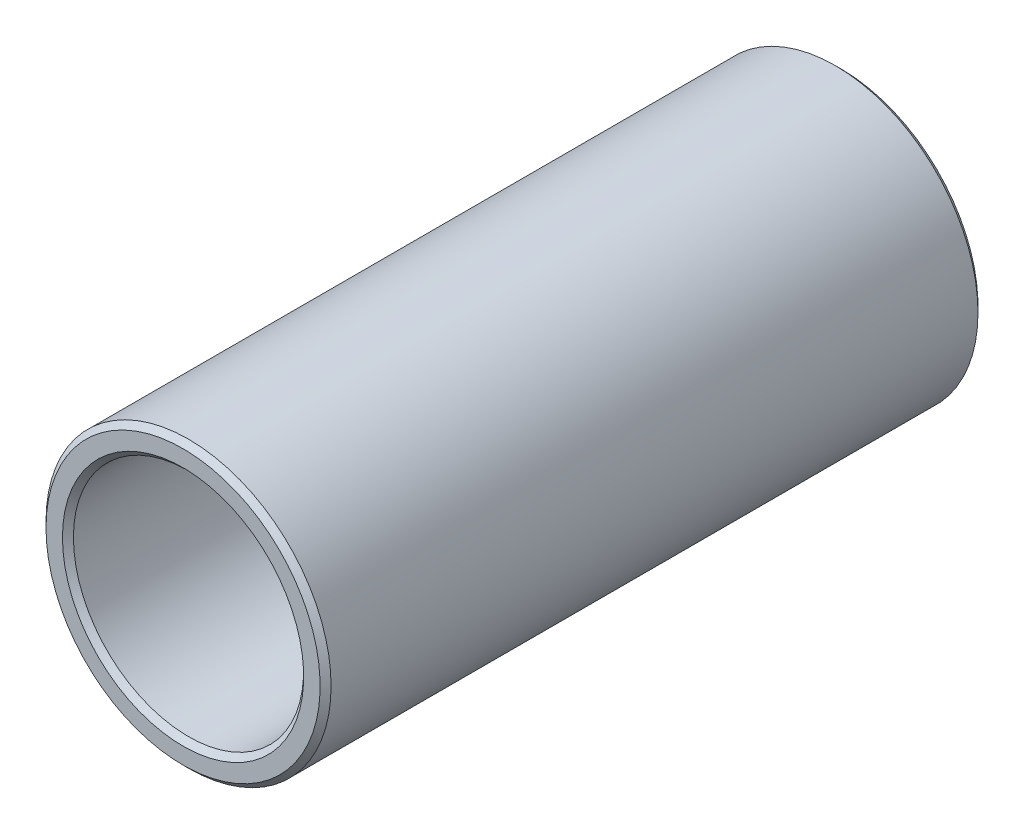
ISO-10303-21;
HEADER;
FILE_DESCRIPTION(('STEP AP214'),'2;1');
FILE_NAME('part.step','',(''),(''),'','','');
FILE_SCHEMA(('AUTOMOTIVE_DESIGN { 1 0 10303 214 1 1 1 1 }'));
ENDSEC;
DATA;
#1=APPLICATION_CONTEXT('core data for automotive mechanical design processes');
#2=APPLICATION_PROTOCOL_DEFINITION('international standard','automotive_design',2000,#1);
#3=PRODUCT_CONTEXT('',#1,'mechanical');
#4=PRODUCT('Part','Part','',(#3));
#5=PRODUCT_RELATED_PRODUCT_CATEGORY('part','',(#4));
#6=PRODUCT_DEFINITION_FORMATION('','',#4);
#7=PRODUCT_DEFINITION_CONTEXT('part definition',#1,'design');
#8=PRODUCT_DEFINITION('design','',#6,#7);
#9=PRODUCT_DEFINITION_SHAPE('','',#8);
#10=(LENGTH_UNIT() NAMED_UNIT(*) SI_UNIT(.MILLI.,.METRE.));
#11=(NAMED_UNIT(*) PLANE_ANGLE_UNIT() SI_UNIT($,.RADIAN.));
#12=(NAMED_UNIT(*) SI_UNIT($,.STERADIAN.) SOLID_ANGLE_UNIT());
#13=UNCERTAINTY_MEASURE_WITH_UNIT(LENGTH_MEASURE(1.E-05),#10,'distance_accuracy_value','');
#14=(GEOMETRIC_REPRESENTATION_CONTEXT(3) GLOBAL_UNCERTAINTY_ASSIGNED_CONTEXT((#13)) GLOBAL_UNIT_ASSIGNED_CONTEXT((#10,
#11,#12)) REPRESENTATION_CONTEXT('',''));
#15=CARTESIAN_POINT('',(0.,0.,0.));
#16=DIRECTION('',(0.,0.,1.));
#17=DIRECTION('',(1.,0.,0.));
#18=AXIS2_PLACEMENT_3D('',#15,#16,#17);
#19=CARTESIAN_POINT('',(0.,0.,60.005));
#20=DIRECTION('',(0.,0.,-1.));
#21=DIRECTION('',(-1.,0.,0.));
#22=AXIS2_PLACEMENT_3D('',#19,#20,#21);
#23=CYLINDRICAL_SURFACE('',#22,5.053);
#24=CARTESIAN_POINT('',(0.,0.,0.947000000000003));
#25=DIRECTION('',(0.,0.,-1.));
#26=DIRECTION('',(-1.,0.,0.));
#27=AXIS2_PLACEMENT_3D('',#24,#25,#26);
#28=CIRCLE('',#27,5.053);
#29=CARTESIAN_POINT('',(-5.053,0.,0.947000000000003));
#30=VERTEX_POINT('',#29);
#31=EDGE_CURVE('E10',#30,#30,#28,.T.);
#32=ORIENTED_EDGE('',*,*,#31,.T.);
#33=EDGE_LOOP('',(#32));
#34=FACE_BOUND('',#33,.T.);
#35=CARTESIAN_POINT('',(0.,0.,12.053));
#36=DIRECTION('',(0.,0.,-1.));
#37=DIRECTION('',(-1.,0.,0.));
#38=AXIS2_PLACEMENT_3D('',#35,#36,#37);
#39=CIRCLE('',#38,5.053);
#40=CARTESIAN_POINT('',(-5.053,0.,12.053));
#41=VERTEX_POINT('',#40);
#42=EDGE_CURVE('E69',#41,#41,#39,.T.);
#43=ORIENTED_EDGE('',*,*,#42,.F.);
#44=EDGE_LOOP('',(#43));
#45=FACE_BOUND('',#44,.T.);
#46=ADVANCED_FACE('F35',(#34,#45),#23,.F.);
#47=CARTESIAN_POINT('',(0.,0.,0.947000000000003));
#48=DIRECTION('',(0.,0.,-1.));
#49=DIRECTION('',(-1.,0.,0.));
#50=AXIS2_PLACEMENT_3D('',#47,#48,#49);
#51=CONICAL_SURFACE('',#50,5.053,0.785398163397447);
#52=CARTESIAN_POINT('',(0.,0.,0.));
#53=DIRECTION('',(0.,0.,-1.));
#54=DIRECTION('',(-1.,0.,0.));
#55=AXIS2_PLACEMENT_3D('',#52,#53,#54);
#56=CIRCLE('',#55,6.);
#57=CARTESIAN_POINT('',(-6.,0.,0.));
#58=VERTEX_POINT('',#57);
#59=EDGE_CURVE('E41',#58,#58,#56,.T.);
#60=ORIENTED_EDGE('',*,*,#59,.T.);
#61=EDGE_LOOP('',(#60));
#62=FACE_BOUND('',#61,.T.);
#63=ORIENTED_EDGE('',*,*,#31,.F.);
#64=EDGE_LOOP('',(#63));
#65=FACE_BOUND('',#64,.T.);
#66=ADVANCED_FACE('F77',(#62,#65),#51,.F.);
#67=CARTESIAN_POINT('',(6.,0.,0.));
#68=DIRECTION('',(0.,0.,-1.));
#69=DIRECTION('',(-1.,0.,0.));
#70=AXIS2_PLACEMENT_3D('',#67,#68,#69);
#71=PLANE('',#70);
#72=CARTESIAN_POINT('',(0.,0.,0.));
#73=DIRECTION('',(0.,0.,-1.));
#74=DIRECTION('',(-1.,0.,0.));
#75=AXIS2_PLACEMENT_3D('',#72,#73,#74);
#76=CIRCLE('',#75,12.5);
#77=CARTESIAN_POINT('',(-12.5,0.,0.));
#78=VERTEX_POINT('',#77);
#79=EDGE_CURVE('E45',#78,#78,#76,.T.);
#80=ORIENTED_EDGE('',*,*,#79,.T.);
#81=EDGE_LOOP('',(#80));
#82=FACE_BOUND('',#81,.T.);
#83=ORIENTED_EDGE('',*,*,#59,.F.);
#84=EDGE_LOOP('',(#83));
#85=FACE_BOUND('',#84,.T.);
#86=ADVANCED_FACE('F81',(#82,#85),#71,.T.);
#87=CARTESIAN_POINT('',(0.,0.,0.));
#88=DIRECTION('',(0.,0.,1.));
#89=DIRECTION('',(1.,0.,0.));
#90=AXIS2_PLACEMENT_3D('',#87,#88,#89);
#91=CONICAL_SURFACE('',#90,12.5,0.78539816339745);
#92=CARTESIAN_POINT('',(0.,0.,0.5));
#93=DIRECTION('',(0.,0.,-1.));
#94=DIRECTION('',(-1.,0.,0.));
#95=AXIS2_PLACEMENT_3D('',#92,#93,#94);
#96=CIRCLE('',#95,13.);
#97=CARTESIAN_POINT('',(-13.,0.,0.5));
#98=VERTEX_POINT('',#97);
#99=EDGE_CURVE('E49',#98,#98,#96,.T.);
#100=ORIENTED_EDGE('',*,*,#99,.T.);
#101=EDGE_LOOP('',(#100));
#102=FACE_BOUND('',#101,.T.);
#103=ORIENTED_EDGE('',*,*,#79,.F.);
#104=EDGE_LOOP('',(#103));
#105=FACE_BOUND('',#104,.T.);
#106=ADVANCED_FACE('F85',(#102,#105),#91,.T.);
#107=CARTESIAN_POINT('',(0.,0.,60.005));
#108=DIRECTION('',(0.,0.,-1.));
#109=DIRECTION('',(-1.,0.,0.));
#110=AXIS2_PLACEMENT_3D('',#107,#108,#109);
#111=CYLINDRICAL_SURFACE('',#110,13.);
#112=CARTESIAN_POINT('',(0.,0.,59.5));
#113=DIRECTION('',(0.,0.,-1.));
#114=DIRECTION('',(-1.,0.,0.));
#115=AXIS2_PLACEMENT_3D('',#112,#113,#114);
#116=CIRCLE('',#115,13.);
#117=CARTESIAN_POINT('',(-13.,0.,59.5));
#118=VERTEX_POINT('',#117);
#119=EDGE_CURVE('E54',#118,#118,#116,.T.);
#120=ORIENTED_EDGE('',*,*,#119,.T.);
#121=EDGE_LOOP('',(#120));
#122=FACE_BOUND('',#121,.T.);
#123=ORIENTED_EDGE('',*,*,#99,.F.);
#124=EDGE_LOOP('',(#123));
#125=FACE_BOUND('',#124,.T.);
#126=ADVANCED_FACE('F92',(#122,#125),#111,.T.);
#127=CARTESIAN_POINT('',(0.,0.,59.5));
#128=DIRECTION('',(0.,0.,-1.));
#129=DIRECTION('',(-1.,0.,0.));
#130=AXIS2_PLACEMENT_3D('',#127,#128,#129);
#131=CONICAL_SURFACE('',#130,13.,0.78539816339745);
#132=CARTESIAN_POINT('',(0.,0.,60.));
#133=DIRECTION('',(0.,0.,-1.));
#134=DIRECTION('',(-1.,0.,0.));
#135=AXIS2_PLACEMENT_3D('',#132,#133,#134);
#136=CIRCLE('',#135,12.5);
#137=CARTESIAN_POINT('',(-12.5,0.,60.));
#138=VERTEX_POINT('',#137);
#139=EDGE_CURVE('E57',#138,#138,#136,.T.);
#140=ORIENTED_EDGE('',*,*,#139,.T.);
#141=EDGE_LOOP('',(#140));
#142=FACE_BOUND('',#141,.T.);
#143=ORIENTED_EDGE('',*,*,#119,.F.);
#144=EDGE_LOOP('',(#143));
#145=FACE_BOUND('',#144,.T.);
#146=ADVANCED_FACE('F96',(#142,#145),#131,.T.);
#147=CARTESIAN_POINT('',(12.5,0.,60.));
#148=DIRECTION('',(0.,0.,1.));
#149=DIRECTION('',(1.,0.,0.));
#150=AXIS2_PLACEMENT_3D('',#147,#148,#149);
#151=PLANE('',#150);
#152=CARTESIAN_POINT('',(0.,0.,60.));
#153=DIRECTION('',(0.,0.,-1.));
#154=DIRECTION('',(-1.,0.,0.));
#155=AXIS2_PLACEMENT_3D('',#152,#153,#154);
#156=CIRCLE('',#155,11.);
#157=CARTESIAN_POINT('',(-11.,0.,60.));
#158=VERTEX_POINT('',#157);
#159=EDGE_CURVE('E60',#158,#158,#156,.T.);
#160=ORIENTED_EDGE('',*,*,#159,.T.);
#161=EDGE_LOOP('',(#160));
#162=FACE_BOUND('',#161,.T.);
#163=ORIENTED_EDGE('',*,*,#139,.F.);
#164=EDGE_LOOP('',(#163));
#165=FACE_BOUND('',#164,.T.);
#166=ADVANCED_FACE('F100',(#162,#165),#151,.T.);
#167=CARTESIAN_POINT('',(0.,0.,60.));
#168=DIRECTION('',(0.,0.,1.));
#169=DIRECTION('',(1.,0.,0.));
#170=AXIS2_PLACEMENT_3D('',#167,#168,#169);
#171=CONICAL_SURFACE('',#170,11.,0.785398163397448);
#172=CARTESIAN_POINT('',(0.,0.,59.5));
#173=DIRECTION('',(0.,0.,-1.));
#174=DIRECTION('',(-1.,0.,0.));
#175=AXIS2_PLACEMENT_3D('',#172,#173,#174);
#176=CIRCLE('',#175,10.5);
#177=CARTESIAN_POINT('',(-10.5,0.,59.5));
#178=VERTEX_POINT('',#177);
#179=EDGE_CURVE('E63',#178,#178,#176,.T.);
#180=ORIENTED_EDGE('',*,*,#179,.T.);
#181=EDGE_LOOP('',(#180));
#182=FACE_BOUND('',#181,.T.);
#183=ORIENTED_EDGE('',*,*,#159,.F.);
#184=EDGE_LOOP('',(#183));
#185=FACE_BOUND('',#184,.T.);
#186=ADVANCED_FACE('F104',(#182,#185),#171,.F.);
#187=CARTESIAN_POINT('',(0.,0.,60.005));
#188=DIRECTION('',(0.,0.,-1.));
#189=DIRECTION('',(-1.,0.,0.));
#190=AXIS2_PLACEMENT_3D('',#187,#188,#189);
#191=CYLINDRICAL_SURFACE('',#190,10.5);
#192=CARTESIAN_POINT('',(0.,0.,13.));
#193=DIRECTION('',(0.,0.,-1.));
#194=DIRECTION('',(-1.,0.,0.));
#195=AXIS2_PLACEMENT_3D('',#192,#193,#194);
#196=CIRCLE('',#195,10.5);
#197=CARTESIAN_POINT('',(-10.5,0.,13.));
#198=VERTEX_POINT('',#197);
#199=EDGE_CURVE('E66',#198,#198,#196,.T.);
#200=ORIENTED_EDGE('',*,*,#199,.T.);
#201=EDGE_LOOP('',(#200));
#202=FACE_BOUND('',#201,.T.);
#203=ORIENTED_EDGE('',*,*,#179,.F.);
#204=EDGE_LOOP('',(#203));
#205=FACE_BOUND('',#204,.T.);
#206=ADVANCED_FACE('F108',(#202,#205),#191,.F.);
#207=CARTESIAN_POINT('',(0.,0.,13.));
#208=DIRECTION('',(0.,0.,1.));
#209=DIRECTION('',(1.,0.,0.));
#210=AXIS2_PLACEMENT_3D('',#207,#208,#209);
#211=CONICAL_SURFACE('',#210,10.5,1.39865974682862);
#212=ORIENTED_EDGE('',*,*,#42,.T.);
#213=EDGE_LOOP('',(#212));
#214=FACE_BOUND('',#213,.T.);
#215=ORIENTED_EDGE('',*,*,#199,.F.);
#216=EDGE_LOOP('',(#215));
#217=FACE_BOUND('',#216,.T.);
#218=ADVANCED_FACE('F73',(#214,#217),#211,.F.);
#219=CLOSED_SHELL('',(#46,#66,#86,#106,#126,#146,#166,#186,#206,#218));
#220=MANIFOLD_SOLID_BREP('B2',#219);
#221=ADVANCED_BREP_SHAPE_REPRESENTATION('',(#18,#220),#14);
#222=SHAPE_DEFINITION_REPRESENTATION(#9,#221);
ENDSEC;
END-ISO-10303-21;
